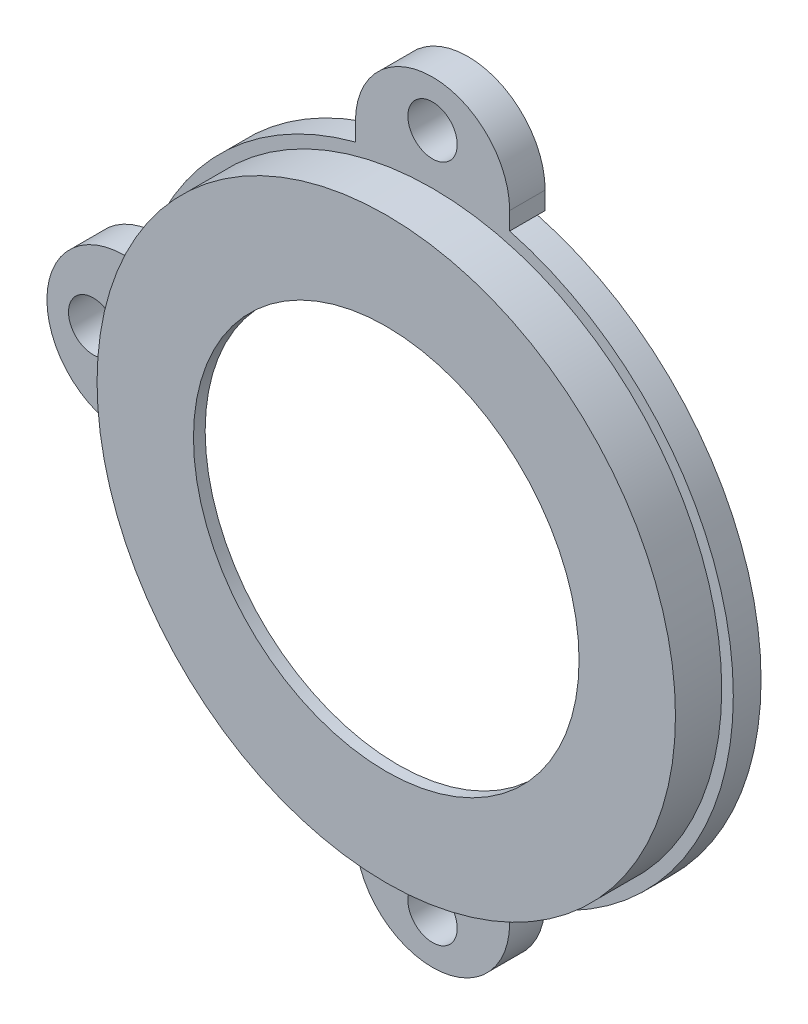
ISO-10303-21;
HEADER;
FILE_DESCRIPTION(('STEP AP214'),'2;1');
FILE_NAME('part.step','',(''),(''),'','','');
FILE_SCHEMA(('AUTOMOTIVE_DESIGN { 1 0 10303 214 1 1 1 1 }'));
ENDSEC;
DATA;
#1=APPLICATION_CONTEXT('core data for automotive mechanical design processes');
#2=APPLICATION_PROTOCOL_DEFINITION('international standard','automotive_design',2000,#1);
#3=PRODUCT_CONTEXT('',#1,'mechanical');
#4=PRODUCT('Part','Part','',(#3));
#5=PRODUCT_RELATED_PRODUCT_CATEGORY('part','',(#4));
#6=PRODUCT_DEFINITION_FORMATION('','',#4);
#7=PRODUCT_DEFINITION_CONTEXT('part definition',#1,'design');
#8=PRODUCT_DEFINITION('design','',#6,#7);
#9=PRODUCT_DEFINITION_SHAPE('','',#8);
#10=(LENGTH_UNIT() NAMED_UNIT(*) SI_UNIT(.MILLI.,.METRE.));
#11=(NAMED_UNIT(*) PLANE_ANGLE_UNIT() SI_UNIT($,.RADIAN.));
#12=(NAMED_UNIT(*) SI_UNIT($,.STERADIAN.) SOLID_ANGLE_UNIT());
#13=UNCERTAINTY_MEASURE_WITH_UNIT(LENGTH_MEASURE(1.E-05),#10,'distance_accuracy_value','');
#14=(GEOMETRIC_REPRESENTATION_CONTEXT(3) GLOBAL_UNCERTAINTY_ASSIGNED_CONTEXT((#13)) GLOBAL_UNIT_ASSIGNED_CONTEXT((#10,
#11,#12)) REPRESENTATION_CONTEXT('',''));
#15=CARTESIAN_POINT('',(0.,0.,0.));
#16=DIRECTION('',(0.,0.,1.));
#17=DIRECTION('',(1.,0.,0.));
#18=AXIS2_PLACEMENT_3D('',#15,#16,#17);
#19=CARTESIAN_POINT('',(0.,0.,1.8));
#20=DIRECTION('',(0.,0.,1.));
#21=DIRECTION('',(1.,0.,0.));
#22=AXIS2_PLACEMENT_3D('',#19,#20,#21);
#23=PLANE('',#22);
#24=CARTESIAN_POINT('',(-3.58827050328753E-12,-22.,1.8));
#25=DIRECTION('',(0.,0.,1.));
#26=DIRECTION('',(1.,0.,0.));
#27=AXIS2_PLACEMENT_3D('',#24,#25,#26);
#28=CIRCLE('',#27,1.6);
#29=CARTESIAN_POINT('',(1.59999999999641,-22.,1.8));
#30=VERTEX_POINT('',#29);
#31=EDGE_CURVE('E302',#30,#30,#28,.T.);
#32=ORIENTED_EDGE('',*,*,#31,.F.);
#33=EDGE_LOOP('',(#32));
#34=FACE_BOUND('',#33,.T.);
#35=CARTESIAN_POINT('',(0.,22.,1.8));
#36=DIRECTION('',(0.,0.,1.));
#37=DIRECTION('',(1.,0.,0.));
#38=AXIS2_PLACEMENT_3D('',#35,#36,#37);
#39=CIRCLE('',#38,1.6);
#40=CARTESIAN_POINT('',(1.6,22.,1.8));
#41=VERTEX_POINT('',#40);
#42=EDGE_CURVE('E199',#41,#41,#39,.T.);
#43=ORIENTED_EDGE('',*,*,#42,.F.);
#44=EDGE_LOOP('',(#43));
#45=FACE_BOUND('',#44,.T.);
#46=CARTESIAN_POINT('',(0.,-20.,1.8));
#47=DIRECTION('',(0.,0.,1.));
#48=DIRECTION('',(1.,0.,0.));
#49=AXIS2_PLACEMENT_3D('',#46,#47,#48);
#50=CIRCLE('',#49,5.);
#51=CARTESIAN_POINT('',(-5.,-20.,1.8));
#52=VERTEX_POINT('',#51);
#53=CARTESIAN_POINT('',(0.,-25.,1.8));
#54=VERTEX_POINT('',#53);
#55=EDGE_CURVE('E61',#52,#54,#50,.T.);
#56=ORIENTED_EDGE('',*,*,#55,.T.);
#57=CARTESIAN_POINT('',(0.,-20.,1.8));
#58=DIRECTION('',(0.,0.,1.));
#59=DIRECTION('',(1.,0.,0.));
#60=AXIS2_PLACEMENT_3D('',#57,#58,#59);
#61=CIRCLE('',#60,5.);
#62=CARTESIAN_POINT('',(5.,-20.,1.8));
#63=VERTEX_POINT('',#62);
#64=EDGE_CURVE('E380',#54,#63,#61,.T.);
#65=ORIENTED_EDGE('',*,*,#64,.T.);
#66=DIRECTION('',(0.,1.,0.));
#67=VECTOR('',#66,1.);
#68=CARTESIAN_POINT('',(5.,-25.,1.8));
#69=LINE('',#68,#67);
#70=CARTESIAN_POINT('',(5.,-18.8480768249708,1.8));
#71=VERTEX_POINT('',#70);
#72=EDGE_CURVE('E185',#63,#71,#69,.T.);
#73=ORIENTED_EDGE('',*,*,#72,.T.);
#74=CARTESIAN_POINT('',(0.,0.,1.8));
#75=DIRECTION('',(0.,0.,1.));
#76=DIRECTION('',(1.,0.,0.));
#77=AXIS2_PLACEMENT_3D('',#74,#75,#76);
#78=CIRCLE('',#77,19.5);
#79=CARTESIAN_POINT('',(5.,18.8480768249708,1.8));
#80=VERTEX_POINT('',#79);
#81=EDGE_CURVE('E179',#71,#80,#78,.T.);
#82=ORIENTED_EDGE('',*,*,#81,.T.);
#83=DIRECTION('',(0.,1.,0.));
#84=VECTOR('',#83,1.);
#85=CARTESIAN_POINT('',(5.,18.8480768249708,1.8));
#86=LINE('',#85,#84);
#87=CARTESIAN_POINT('',(5.,20.,1.8));
#88=VERTEX_POINT('',#87);
#89=EDGE_CURVE('E316',#80,#88,#86,.T.);
#90=ORIENTED_EDGE('',*,*,#89,.T.);
#91=CARTESIAN_POINT('',(0.,20.,1.8));
#92=DIRECTION('',(0.,0.,1.));
#93=DIRECTION('',(1.,0.,0.));
#94=AXIS2_PLACEMENT_3D('',#91,#92,#93);
#95=CIRCLE('',#94,5.);
#96=CARTESIAN_POINT('',(0.,25.,1.8));
#97=VERTEX_POINT('',#96);
#98=EDGE_CURVE('E375',#88,#97,#95,.T.);
#99=ORIENTED_EDGE('',*,*,#98,.T.);
#100=CARTESIAN_POINT('',(0.,20.,1.8));
#101=DIRECTION('',(0.,0.,1.));
#102=DIRECTION('',(1.,0.,0.));
#103=AXIS2_PLACEMENT_3D('',#100,#101,#102);
#104=CIRCLE('',#103,5.);
#105=CARTESIAN_POINT('',(-5.,20.,1.8));
#106=VERTEX_POINT('',#105);
#107=EDGE_CURVE('E372',#97,#106,#104,.T.);
#108=ORIENTED_EDGE('',*,*,#107,.T.);
#109=DIRECTION('',(0.,-1.,0.));
#110=VECTOR('',#109,1.);
#111=CARTESIAN_POINT('',(-5.,25.,1.8));
#112=LINE('',#111,#110);
#113=CARTESIAN_POINT('',(-5.00000000000001,18.8480768249708,1.8));
#114=VERTEX_POINT('',#113);
#115=EDGE_CURVE('E321',#106,#114,#112,.T.);
#116=ORIENTED_EDGE('',*,*,#115,.T.);
#117=CARTESIAN_POINT('',(0.,0.,1.8));
#118=DIRECTION('',(0.,0.,1.));
#119=DIRECTION('',(1.,0.,0.));
#120=AXIS2_PLACEMENT_3D('',#117,#118,#119);
#121=CIRCLE('',#120,19.5);
#122=CARTESIAN_POINT('',(-18.8480768249704,5.00000000000154,1.8));
#123=VERTEX_POINT('',#122);
#124=EDGE_CURVE('E324',#114,#123,#121,.T.);
#125=ORIENTED_EDGE('',*,*,#124,.T.);
#126=DIRECTION('',(-1.,0.,0.));
#127=VECTOR('',#126,1.);
#128=CARTESIAN_POINT('',(-18.8480768249704,5.00000000000154,1.8));
#129=LINE('',#128,#127);
#130=CARTESIAN_POINT('',(-20.,5.00000000000154,1.8));
#131=VERTEX_POINT('',#130);
#132=EDGE_CURVE('E327',#123,#131,#129,.T.);
#133=ORIENTED_EDGE('',*,*,#132,.T.);
#134=CARTESIAN_POINT('',(-20.,1.53783236145344E-12,1.8));
#135=DIRECTION('',(0.,0.,1.));
#136=DIRECTION('',(1.,0.,0.));
#137=AXIS2_PLACEMENT_3D('',#134,#135,#136);
#138=CIRCLE('',#137,5.);
#139=CARTESIAN_POINT('',(-25.,1.53783236145344E-12,1.8));
#140=VERTEX_POINT('',#139);
#141=EDGE_CURVE('E366',#131,#140,#138,.T.);
#142=ORIENTED_EDGE('',*,*,#141,.T.);
#143=CARTESIAN_POINT('',(-20.,1.53696499971545E-12,1.8));
#144=DIRECTION('',(0.,0.,1.));
#145=DIRECTION('',(1.,0.,0.));
#146=AXIS2_PLACEMENT_3D('',#143,#144,#145);
#147=CIRCLE('',#146,5.);
#148=CARTESIAN_POINT('',(-20.,-4.99999999999846,1.8));
#149=VERTEX_POINT('',#148);
#150=EDGE_CURVE('E369',#140,#149,#147,.T.);
#151=ORIENTED_EDGE('',*,*,#150,.T.);
#152=DIRECTION('',(1.,0.,0.));
#153=VECTOR('',#152,1.);
#154=CARTESIAN_POINT('',(-25.,-4.99999999999846,1.8));
#155=LINE('',#154,#153);
#156=CARTESIAN_POINT('',(-18.8480768249704,-4.99999999999846,1.8));
#157=VERTEX_POINT('',#156);
#158=EDGE_CURVE('E331',#149,#157,#155,.T.);
#159=ORIENTED_EDGE('',*,*,#158,.T.);
#160=CARTESIAN_POINT('',(0.,0.,1.8));
#161=DIRECTION('',(0.,0.,1.));
#162=DIRECTION('',(1.,0.,0.));
#163=AXIS2_PLACEMENT_3D('',#160,#161,#162);
#164=CIRCLE('',#163,19.4999999999992);
#165=CARTESIAN_POINT('',(-5.,-18.8480768249699,1.8));
#166=VERTEX_POINT('',#165);
#167=EDGE_CURVE('E334',#157,#166,#164,.T.);
#168=ORIENTED_EDGE('',*,*,#167,.T.);
#169=DIRECTION('',(0.,-1.,0.));
#170=VECTOR('',#169,1.);
#171=CARTESIAN_POINT('',(-5.,-18.8480768249699,1.8));
#172=LINE('',#171,#170);
#173=EDGE_CURVE('E337',#166,#52,#172,.T.);
#174=ORIENTED_EDGE('',*,*,#173,.T.);
#175=EDGE_LOOP('',(#56,#65,#73,#82,#90,#99,#108,#116,#125,#133,#142,#151,#159,#168,#174));
#176=FACE_BOUND('',#175,.T.);
#177=CARTESIAN_POINT('',(-22.,1.79413525164376E-12,1.8));
#178=DIRECTION('',(0.,0.,1.));
#179=DIRECTION('',(1.,0.,0.));
#180=AXIS2_PLACEMENT_3D('',#177,#178,#179);
#181=CIRCLE('',#180,1.6);
#182=CARTESIAN_POINT('',(-20.4,1.79413525164376E-12,1.8));
#183=VERTEX_POINT('',#182);
#184=EDGE_CURVE('E306',#183,#183,#181,.T.);
#185=ORIENTED_EDGE('',*,*,#184,.F.);
#186=EDGE_LOOP('',(#185));
#187=FACE_BOUND('',#186,.T.);
#188=CARTESIAN_POINT('',(0.,0.,1.8));
#189=DIRECTION('',(0.,0.,1.));
#190=DIRECTION('',(1.,0.,0.));
#191=AXIS2_PLACEMENT_3D('',#188,#189,#190);
#192=CIRCLE('',#191,18.75);
#193=CARTESIAN_POINT('',(18.75,0.,1.8));
#194=VERTEX_POINT('',#193);
#195=EDGE_CURVE('E293',#194,#194,#192,.T.);
#196=ORIENTED_EDGE('',*,*,#195,.F.);
#197=EDGE_LOOP('',(#196));
#198=FACE_BOUND('',#197,.T.);
#199=ADVANCED_FACE('F43',(#34,#45,#176,#187,#198),#23,.T.);
#200=CARTESIAN_POINT('',(0.,0.,1.8));
#201=DIRECTION('',(0.,0.,-1.));
#202=DIRECTION('',(-1.,0.,0.));
#203=AXIS2_PLACEMENT_3D('',#200,#201,#202);
#204=CYLINDRICAL_SURFACE('',#203,19.5);
#205=CARTESIAN_POINT('',(0.,0.,0.));
#206=DIRECTION('',(0.,0.,1.));
#207=DIRECTION('',(1.,0.,0.));
#208=AXIS2_PLACEMENT_3D('',#205,#206,#207);
#209=CIRCLE('',#208,19.5);
#210=CARTESIAN_POINT('',(4.99999999999986,-18.8480768249702,0.));
#211=VERTEX_POINT('',#210);
#212=CARTESIAN_POINT('',(5.,18.8480768249708,0.));
#213=VERTEX_POINT('',#212);
#214=EDGE_CURVE('E176',#211,#213,#209,.T.);
#215=ORIENTED_EDGE('',*,*,#214,.T.);
#216=DIRECTION('',(0.,0.,-1.));
#217=VECTOR('',#216,1.);
#218=CARTESIAN_POINT('',(5.,18.8480768249708,1.8));
#219=LINE('',#218,#217);
#220=EDGE_CURVE('E360',#80,#213,#219,.T.);
#221=ORIENTED_EDGE('',*,*,#220,.F.);
#222=ORIENTED_EDGE('',*,*,#81,.F.);
#223=DIRECTION('',(0.,0.,-1.));
#224=VECTOR('',#223,1.);
#225=CARTESIAN_POINT('',(5.,-18.8480768249708,1.8));
#226=LINE('',#225,#224);
#227=EDGE_CURVE('E172',#71,#211,#226,.T.);
#228=ORIENTED_EDGE('',*,*,#227,.T.);
#229=EDGE_LOOP('',(#215,#221,#222,#228));
#230=FACE_BOUND('',#229,.T.);
#231=ADVANCED_FACE('F174',(#230),#204,.T.);
#232=CARTESIAN_POINT('',(5.,18.8480768249708,1.8));
#233=DIRECTION('',(-1.,0.,0.));
#234=DIRECTION('',(0.,-1.,0.));
#235=AXIS2_PLACEMENT_3D('',#232,#233,#234);
#236=PLANE('',#235);
#237=ORIENTED_EDGE('',*,*,#220,.T.);
#238=DIRECTION('',(0.,0.,1.));
#239=VECTOR('',#238,1.);
#240=CARTESIAN_POINT('',(5.,18.8480768249708,-0.5));
#241=LINE('',#240,#239);
#242=CARTESIAN_POINT('',(5.,18.8480768249708,-0.5));
#243=VERTEX_POINT('',#242);
#244=EDGE_CURVE('E212',#243,#213,#241,.T.);
#245=ORIENTED_EDGE('',*,*,#244,.F.);
#246=DIRECTION('',(0.,-1.,0.));
#247=VECTOR('',#246,1.);
#248=CARTESIAN_POINT('',(5.,20.,-0.5));
#249=LINE('',#248,#247);
#250=CARTESIAN_POINT('',(5.,20.,-0.5));
#251=VERTEX_POINT('',#250);
#252=EDGE_CURVE('E272',#251,#243,#249,.T.);
#253=ORIENTED_EDGE('',*,*,#252,.F.);
#254=DIRECTION('',(0.,0.,-1.));
#255=VECTOR('',#254,1.);
#256=CARTESIAN_POINT('',(5.,20.,1.8));
#257=LINE('',#256,#255);
#258=EDGE_CURVE('E385',#251,#88,#257,.F.);
#259=ORIENTED_EDGE('',*,*,#258,.T.);
#260=ORIENTED_EDGE('',*,*,#89,.F.);
#261=EDGE_LOOP('',(#237,#245,#253,#259,#260));
#262=FACE_BOUND('',#261,.T.);
#263=ADVANCED_FACE('F441',(#262),#236,.F.);
#264=CARTESIAN_POINT('',(-5.,25.,1.8));
#265=DIRECTION('',(1.,0.,0.));
#266=DIRECTION('',(0.,1.,0.));
#267=AXIS2_PLACEMENT_3D('',#264,#265,#266);
#268=PLANE('',#267);
#269=ORIENTED_EDGE('',*,*,#115,.F.);
#270=DIRECTION('',(0.,0.,-1.));
#271=VECTOR('',#270,1.);
#272=CARTESIAN_POINT('',(-5.,20.,1.8));
#273=LINE('',#272,#271);
#274=CARTESIAN_POINT('',(-5.,20.,-0.5));
#275=VERTEX_POINT('',#274);
#276=EDGE_CURVE('E389',#106,#275,#273,.T.);
#277=ORIENTED_EDGE('',*,*,#276,.T.);
#278=DIRECTION('',(0.,1.,0.));
#279=VECTOR('',#278,1.);
#280=CARTESIAN_POINT('',(-5.00000000000001,18.8480768249708,-0.5));
#281=LINE('',#280,#279);
#282=CARTESIAN_POINT('',(-5.00000000000001,18.8480768249708,-0.5));
#283=VERTEX_POINT('',#282);
#284=EDGE_CURVE('E278',#283,#275,#281,.T.);
#285=ORIENTED_EDGE('',*,*,#284,.F.);
#286=DIRECTION('',(0.,0.,1.));
#287=VECTOR('',#286,1.);
#288=CARTESIAN_POINT('',(-5.00000000000001,18.8480768249708,-0.5));
#289=LINE('',#288,#287);
#290=CARTESIAN_POINT('',(-5.00000000000001,18.8480768249708,0.));
#291=VERTEX_POINT('',#290);
#292=EDGE_CURVE('E282',#283,#291,#289,.T.);
#293=ORIENTED_EDGE('',*,*,#292,.T.);
#294=DIRECTION('',(0.,0.,-1.));
#295=VECTOR('',#294,1.);
#296=CARTESIAN_POINT('',(-5.00000000000001,18.8480768249708,1.8));
#297=LINE('',#296,#295);
#298=EDGE_CURVE('E357',#114,#291,#297,.T.);
#299=ORIENTED_EDGE('',*,*,#298,.F.);
#300=EDGE_LOOP('',(#269,#277,#285,#293,#299));
#301=FACE_BOUND('',#300,.T.);
#302=ADVANCED_FACE('F608',(#301),#268,.F.);
#303=CARTESIAN_POINT('',(0.,0.,1.8));
#304=DIRECTION('',(0.,0.,-1.));
#305=DIRECTION('',(-1.,0.,0.));
#306=AXIS2_PLACEMENT_3D('',#303,#304,#305);
#307=CYLINDRICAL_SURFACE('',#306,19.5);
#308=CARTESIAN_POINT('',(0.,0.,0.));
#309=DIRECTION('',(0.,0.,1.));
#310=DIRECTION('',(1.,0.,0.));
#311=AXIS2_PLACEMENT_3D('',#308,#309,#310);
#312=CIRCLE('',#311,19.5);
#313=CARTESIAN_POINT('',(-18.8480768249704,5.00000000000154,0.));
#314=VERTEX_POINT('',#313);
#315=EDGE_CURVE('E198',#291,#314,#312,.T.);
#316=ORIENTED_EDGE('',*,*,#315,.T.);
#317=DIRECTION('',(0.,0.,-1.));
#318=VECTOR('',#317,1.);
#319=CARTESIAN_POINT('',(-18.8480768249704,5.00000000000154,1.8));
#320=LINE('',#319,#318);
#321=EDGE_CURVE('E353',#123,#314,#320,.T.);
#322=ORIENTED_EDGE('',*,*,#321,.F.);
#323=ORIENTED_EDGE('',*,*,#124,.F.);
#324=ORIENTED_EDGE('',*,*,#298,.T.);
#325=EDGE_LOOP('',(#316,#322,#323,#324));
#326=FACE_BOUND('',#325,.T.);
#327=ADVANCED_FACE('F596',(#326),#307,.T.);
#328=CARTESIAN_POINT('',(-18.8480768249704,5.00000000000154,1.8));
#329=DIRECTION('',(0.,-1.,0.));
#330=DIRECTION('',(1.,0.,0.));
#331=AXIS2_PLACEMENT_3D('',#328,#329,#330);
#332=PLANE('',#331);
#333=ORIENTED_EDGE('',*,*,#321,.T.);
#334=DIRECTION('',(0.,0.,1.));
#335=VECTOR('',#334,1.);
#336=CARTESIAN_POINT('',(-18.8480768249704,5.00000000000154,-0.5));
#337=LINE('',#336,#335);
#338=CARTESIAN_POINT('',(-18.8480768249704,5.00000000000154,-0.5));
#339=VERTEX_POINT('',#338);
#340=EDGE_CURVE('E238',#339,#314,#337,.T.);
#341=ORIENTED_EDGE('',*,*,#340,.F.);
#342=DIRECTION('',(1.,0.,0.));
#343=VECTOR('',#342,1.);
#344=CARTESIAN_POINT('',(-20.,5.00000000000154,-0.5));
#345=LINE('',#344,#343);
#346=CARTESIAN_POINT('',(-20.,5.00000000000154,-0.5));
#347=VERTEX_POINT('',#346);
#348=EDGE_CURVE('E253',#347,#339,#345,.T.);
#349=ORIENTED_EDGE('',*,*,#348,.F.);
#350=DIRECTION('',(0.,0.,-1.));
#351=VECTOR('',#350,1.);
#352=CARTESIAN_POINT('',(-20.,5.00000000000154,1.8));
#353=LINE('',#352,#351);
#354=EDGE_CURVE('E11',#347,#131,#353,.F.);
#355=ORIENTED_EDGE('',*,*,#354,.T.);
#356=ORIENTED_EDGE('',*,*,#132,.F.);
#357=EDGE_LOOP('',(#333,#341,#349,#355,#356));
#358=FACE_BOUND('',#357,.T.);
#359=ADVANCED_FACE('F587',(#358),#332,.F.);
#360=CARTESIAN_POINT('',(-25.,-4.99999999999846,1.8));
#361=DIRECTION('',(0.,1.,0.));
#362=DIRECTION('',(0.,0.,1.));
#363=AXIS2_PLACEMENT_3D('',#360,#361,#362);
#364=PLANE('',#363);
#365=ORIENTED_EDGE('',*,*,#158,.F.);
#366=DIRECTION('',(0.,0.,-1.));
#367=VECTOR('',#366,1.);
#368=CARTESIAN_POINT('',(-20.,-4.99999999999846,1.8));
#369=LINE('',#368,#367);
#370=CARTESIAN_POINT('',(-20.,-4.99999999999846,-0.5));
#371=VERTEX_POINT('',#370);
#372=EDGE_CURVE('E53',#149,#371,#369,.T.);
#373=ORIENTED_EDGE('',*,*,#372,.T.);
#374=DIRECTION('',(-1.,1.79206476713228E-13,0.));
#375=VECTOR('',#374,1.);
#376=CARTESIAN_POINT('',(-18.8480768249711,-4.99999999999867,-0.5));
#377=LINE('',#376,#375);
#378=CARTESIAN_POINT('',(-18.8480768249711,-4.99999999999867,-0.5));
#379=VERTEX_POINT('',#378);
#380=EDGE_CURVE('E246',#379,#371,#377,.T.);
#381=ORIENTED_EDGE('',*,*,#380,.F.);
#382=DIRECTION('',(0.,0.,1.));
#383=VECTOR('',#382,1.);
#384=CARTESIAN_POINT('',(-18.8480768249711,-4.99999999999867,-0.5));
#385=LINE('',#384,#383);
#386=CARTESIAN_POINT('',(-18.8480768249711,-4.99999999999867,0.));
#387=VERTEX_POINT('',#386);
#388=EDGE_CURVE('E242',#379,#387,#385,.T.);
#389=ORIENTED_EDGE('',*,*,#388,.T.);
#390=DIRECTION('',(0.,0.,-1.));
#391=VECTOR('',#390,1.);
#392=CARTESIAN_POINT('',(-18.8480768249704,-4.99999999999846,1.8));
#393=LINE('',#392,#391);
#394=EDGE_CURVE('E350',#157,#387,#393,.T.);
#395=ORIENTED_EDGE('',*,*,#394,.F.);
#396=EDGE_LOOP('',(#365,#373,#381,#389,#395));
#397=FACE_BOUND('',#396,.T.);
#398=ADVANCED_FACE('F410',(#397),#364,.F.);
#399=CARTESIAN_POINT('',(0.,0.,1.8));
#400=DIRECTION('',(0.,0.,-1.));
#401=DIRECTION('',(-1.,0.,0.));
#402=AXIS2_PLACEMENT_3D('',#399,#400,#401);
#403=CYLINDRICAL_SURFACE('',#402,19.4999999999992);
#404=CARTESIAN_POINT('',(0.,0.,0.));
#405=DIRECTION('',(0.,0.,1.));
#406=DIRECTION('',(1.,0.,0.));
#407=AXIS2_PLACEMENT_3D('',#404,#405,#406);
#408=CIRCLE('',#407,19.4999999999992);
#409=CARTESIAN_POINT('',(-5.,-18.8480768249699,0.));
#410=VERTEX_POINT('',#409);
#411=EDGE_CURVE('E317',#387,#410,#408,.T.);
#412=ORIENTED_EDGE('',*,*,#411,.T.);
#413=DIRECTION('',(0.,0.,-1.));
#414=VECTOR('',#413,1.);
#415=CARTESIAN_POINT('',(-5.,-18.8480768249699,1.8));
#416=LINE('',#415,#414);
#417=EDGE_CURVE('E184',#166,#410,#416,.T.);
#418=ORIENTED_EDGE('',*,*,#417,.F.);
#419=ORIENTED_EDGE('',*,*,#167,.F.);
#420=ORIENTED_EDGE('',*,*,#394,.T.);
#421=EDGE_LOOP('',(#412,#418,#419,#420));
#422=FACE_BOUND('',#421,.T.);
#423=ADVANCED_FACE('F416',(#422),#403,.T.);
#424=CARTESIAN_POINT('',(-5.,-18.8480768249699,1.8));
#425=DIRECTION('',(1.,0.,0.));
#426=DIRECTION('',(0.,1.,0.));
#427=AXIS2_PLACEMENT_3D('',#424,#425,#426);
#428=PLANE('',#427);
#429=ORIENTED_EDGE('',*,*,#417,.T.);
#430=DIRECTION('',(0.,0.,1.));
#431=VECTOR('',#430,1.);
#432=CARTESIAN_POINT('',(-5.,-18.8480768249699,-0.5));
#433=LINE('',#432,#431);
#434=CARTESIAN_POINT('',(-5.,-18.8480768249699,-0.5));
#435=VERTEX_POINT('',#434);
#436=EDGE_CURVE('E209',#435,#410,#433,.T.);
#437=ORIENTED_EDGE('',*,*,#436,.F.);
#438=DIRECTION('',(0.,1.,0.));
#439=VECTOR('',#438,1.);
#440=CARTESIAN_POINT('',(-5.,-20.,-0.5));
#441=LINE('',#440,#439);
#442=CARTESIAN_POINT('',(-5.,-20.,-0.5));
#443=VERTEX_POINT('',#442);
#444=EDGE_CURVE('E227',#443,#435,#441,.T.);
#445=ORIENTED_EDGE('',*,*,#444,.F.);
#446=DIRECTION('',(0.,0.,-1.));
#447=VECTOR('',#446,1.);
#448=CARTESIAN_POINT('',(-5.,-20.,1.8));
#449=LINE('',#448,#447);
#450=EDGE_CURVE('E69',#443,#52,#449,.F.);
#451=ORIENTED_EDGE('',*,*,#450,.T.);
#452=ORIENTED_EDGE('',*,*,#173,.F.);
#453=EDGE_LOOP('',(#429,#437,#445,#451,#452));
#454=FACE_BOUND('',#453,.T.);
#455=ADVANCED_FACE('F425',(#454),#428,.F.);
#456=CARTESIAN_POINT('',(5.,-25.,1.8));
#457=DIRECTION('',(-1.,0.,0.));
#458=DIRECTION('',(0.,-1.,0.));
#459=AXIS2_PLACEMENT_3D('',#456,#457,#458);
#460=PLANE('',#459);
#461=ORIENTED_EDGE('',*,*,#72,.F.);
#462=DIRECTION('',(0.,0.,-1.));
#463=VECTOR('',#462,1.);
#464=CARTESIAN_POINT('',(5.,-20.,1.8));
#465=LINE('',#464,#463);
#466=CARTESIAN_POINT('',(5.,-20.,-0.5));
#467=VERTEX_POINT('',#466);
#468=EDGE_CURVE('E363',#63,#467,#465,.T.);
#469=ORIENTED_EDGE('',*,*,#468,.T.);
#470=DIRECTION('',(0.,-1.,0.));
#471=VECTOR('',#470,1.);
#472=CARTESIAN_POINT('',(4.99999999999991,-18.8480768249704,-0.5));
#473=LINE('',#472,#471);
#474=CARTESIAN_POINT('',(4.99999999999986,-18.8480768249702,-0.5));
#475=VERTEX_POINT('',#474);
#476=EDGE_CURVE('E216',#475,#467,#473,.T.);
#477=ORIENTED_EDGE('',*,*,#476,.F.);
#478=DIRECTION('',(0.,0.,1.));
#479=VECTOR('',#478,1.);
#480=CARTESIAN_POINT('',(4.99999999999986,-18.8480768249702,-0.5));
#481=LINE('',#480,#479);
#482=EDGE_CURVE('E206',#475,#211,#481,.T.);
#483=ORIENTED_EDGE('',*,*,#482,.T.);
#484=ORIENTED_EDGE('',*,*,#227,.F.);
#485=EDGE_LOOP('',(#461,#469,#477,#483,#484));
#486=FACE_BOUND('',#485,.T.);
#487=ADVANCED_FACE('F214',(#486),#460,.F.);
#488=CARTESIAN_POINT('',(0.,0.,1.8));
#489=DIRECTION('',(0.,0.,-1.));
#490=DIRECTION('',(-1.,0.,0.));
#491=AXIS2_PLACEMENT_3D('',#488,#489,#490);
#492=CYLINDRICAL_SURFACE('',#491,12.5);
#493=CARTESIAN_POINT('',(0.,0.,4.04145188432739));
#494=DIRECTION('',(0.,0.,-1.));
#495=DIRECTION('',(-1.,0.,0.));
#496=AXIS2_PLACEMENT_3D('',#493,#494,#495);
#497=CIRCLE('',#496,12.5);
#498=CARTESIAN_POINT('',(-12.5,0.,4.04145188432739));
#499=VERTEX_POINT('',#498);
#500=EDGE_CURVE('E47',#499,#499,#497,.F.);
#501=ORIENTED_EDGE('',*,*,#500,.F.);
#502=EDGE_LOOP('',(#501));
#503=FACE_BOUND('',#502,.T.);
#504=CARTESIAN_POINT('',(0.,0.,4.8));
#505=DIRECTION('',(0.,0.,1.));
#506=DIRECTION('',(1.,0.,0.));
#507=AXIS2_PLACEMENT_3D('',#504,#505,#506);
#508=CIRCLE('',#507,12.5);
#509=CARTESIAN_POINT('',(12.5,0.,4.8));
#510=VERTEX_POINT('',#509);
#511=EDGE_CURVE('E289',#510,#510,#508,.T.);
#512=ORIENTED_EDGE('',*,*,#511,.T.);
#513=EDGE_LOOP('',(#512));
#514=FACE_BOUND('',#513,.T.);
#515=ADVANCED_FACE('F432',(#503,#514),#492,.F.);
#516=CARTESIAN_POINT('',(0.,22.,1.8));
#517=DIRECTION('',(0.,0.,-1.));
#518=DIRECTION('',(-1.,0.,0.));
#519=AXIS2_PLACEMENT_3D('',#516,#517,#518);
#520=CYLINDRICAL_SURFACE('',#519,1.6);
#521=ORIENTED_EDGE('',*,*,#42,.T.);
#522=EDGE_LOOP('',(#521));
#523=FACE_BOUND('',#522,.T.);
#524=CARTESIAN_POINT('',(0.,22.,-0.5));
#525=DIRECTION('',(0.,0.,-1.));
#526=DIRECTION('',(-1.,0.,0.));
#527=AXIS2_PLACEMENT_3D('',#524,#525,#526);
#528=CIRCLE('',#527,1.6);
#529=CARTESIAN_POINT('',(-1.6,22.,-0.5));
#530=VERTEX_POINT('',#529);
#531=EDGE_CURVE('E264',#530,#530,#528,.T.);
#532=ORIENTED_EDGE('',*,*,#531,.T.);
#533=EDGE_LOOP('',(#532));
#534=FACE_BOUND('',#533,.T.);
#535=ADVANCED_FACE('F448',(#523,#534),#520,.F.);
#536=CARTESIAN_POINT('',(-22.,1.79413525164376E-12,1.8));
#537=DIRECTION('',(0.,0.,-1.));
#538=DIRECTION('',(-1.,0.,0.));
#539=AXIS2_PLACEMENT_3D('',#536,#537,#538);
#540=CYLINDRICAL_SURFACE('',#539,1.6);
#541=ORIENTED_EDGE('',*,*,#184,.T.);
#542=EDGE_LOOP('',(#541));
#543=FACE_BOUND('',#542,.T.);
#544=CARTESIAN_POINT('',(-22.,1.79413525164376E-12,-0.5));
#545=DIRECTION('',(0.,0.,-1.));
#546=DIRECTION('',(-1.,0.,0.));
#547=AXIS2_PLACEMENT_3D('',#544,#545,#546);
#548=CIRCLE('',#547,1.6);
#549=CARTESIAN_POINT('',(-23.6,1.79413525164376E-12,-0.5));
#550=VERTEX_POINT('',#549);
#551=EDGE_CURVE('E260',#550,#550,#548,.T.);
#552=ORIENTED_EDGE('',*,*,#551,.T.);
#553=EDGE_LOOP('',(#552));
#554=FACE_BOUND('',#553,.T.);
#555=ADVANCED_FACE('F452',(#543,#554),#540,.F.);
#556=CARTESIAN_POINT('',(-3.58827050328753E-12,-22.,1.8));
#557=DIRECTION('',(0.,0.,-1.));
#558=DIRECTION('',(-1.,0.,0.));
#559=AXIS2_PLACEMENT_3D('',#556,#557,#558);
#560=CYLINDRICAL_SURFACE('',#559,1.6);
#561=ORIENTED_EDGE('',*,*,#31,.T.);
#562=EDGE_LOOP('',(#561));
#563=FACE_BOUND('',#562,.T.);
#564=CARTESIAN_POINT('',(-3.58827050328753E-12,-22.,-0.5));
#565=DIRECTION('',(0.,0.,-1.));
#566=DIRECTION('',(-1.,0.,0.));
#567=AXIS2_PLACEMENT_3D('',#564,#565,#566);
#568=CIRCLE('',#567,1.6);
#569=CARTESIAN_POINT('',(-1.60000000000359,-22.,-0.5));
#570=VERTEX_POINT('',#569);
#571=EDGE_CURVE('E234',#570,#570,#568,.T.);
#572=ORIENTED_EDGE('',*,*,#571,.T.);
#573=EDGE_LOOP('',(#572));
#574=FACE_BOUND('',#573,.T.);
#575=ADVANCED_FACE('F456',(#563,#574),#560,.F.);
#576=CARTESIAN_POINT('',(0.,-20.,1.8));
#577=DIRECTION('',(0.,0.,-1.));
#578=DIRECTION('',(-1.,0.,0.));
#579=AXIS2_PLACEMENT_3D('',#576,#577,#578);
#580=CYLINDRICAL_SURFACE('',#579,5.);
#581=DIRECTION('',(0.,0.,-1.));
#582=VECTOR('',#581,1.);
#583=CARTESIAN_POINT('',(0.,-25.,1.8));
#584=LINE('',#583,#582);
#585=CARTESIAN_POINT('',(0.,-25.,0.));
#586=VERTEX_POINT('',#585);
#587=EDGE_CURVE('E307',#54,#586,#584,.T.);
#588=ORIENTED_EDGE('',*,*,#587,.F.);
#589=ORIENTED_EDGE('',*,*,#55,.F.);
#590=ORIENTED_EDGE('',*,*,#450,.F.);
#591=CARTESIAN_POINT('',(0.,-20.,-0.5));
#592=DIRECTION('',(0.,0.,-1.));
#593=DIRECTION('',(-1.,0.,0.));
#594=AXIS2_PLACEMENT_3D('',#591,#592,#593);
#595=CIRCLE('',#594,5.);
#596=EDGE_CURVE('E230',#467,#443,#595,.T.);
#597=ORIENTED_EDGE('',*,*,#596,.F.);
#598=ORIENTED_EDGE('',*,*,#468,.F.);
#599=ORIENTED_EDGE('',*,*,#64,.F.);
#600=ORIENTED_EDGE('',*,*,#587,.T.);
#601=EDGE_LOOP('',(#588,#589,#590,#597,#598,#599,#600));
#602=FACE_BOUND('',#601,.T.);
#603=ADVANCED_FACE('F418',(#602),#580,.T.);
#604=CARTESIAN_POINT('',(0.,20.,1.8));
#605=DIRECTION('',(0.,0.,-1.));
#606=DIRECTION('',(-1.,0.,0.));
#607=AXIS2_PLACEMENT_3D('',#604,#605,#606);
#608=CYLINDRICAL_SURFACE('',#607,5.);
#609=ORIENTED_EDGE('',*,*,#276,.F.);
#610=ORIENTED_EDGE('',*,*,#107,.F.);
#611=DIRECTION('',(0.,0.,-1.));
#612=VECTOR('',#611,1.);
#613=CARTESIAN_POINT('',(0.,25.,1.8));
#614=LINE('',#613,#612);
#615=CARTESIAN_POINT('',(0.,25.,0.));
#616=VERTEX_POINT('',#615);
#617=EDGE_CURVE('E396',#616,#97,#614,.F.);
#618=ORIENTED_EDGE('',*,*,#617,.F.);
#619=ORIENTED_EDGE('',*,*,#617,.T.);
#620=ORIENTED_EDGE('',*,*,#98,.F.);
#621=ORIENTED_EDGE('',*,*,#258,.F.);
#622=CARTESIAN_POINT('',(0.,20.,-0.5));
#623=DIRECTION('',(0.,0.,-1.));
#624=DIRECTION('',(-1.,0.,0.));
#625=AXIS2_PLACEMENT_3D('',#622,#623,#624);
#626=CIRCLE('',#625,5.);
#627=EDGE_CURVE('E268',#275,#251,#626,.T.);
#628=ORIENTED_EDGE('',*,*,#627,.F.);
#629=EDGE_LOOP('',(#609,#610,#618,#619,#620,#621,#628));
#630=FACE_BOUND('',#629,.T.);
#631=ADVANCED_FACE('F532',(#630),#608,.T.);
#632=CARTESIAN_POINT('',(-20.,1.53783236145344E-12,1.8));
#633=DIRECTION('',(0.,0.,-1.));
#634=DIRECTION('',(-1.,0.,0.));
#635=AXIS2_PLACEMENT_3D('',#632,#633,#634);
#636=CYLINDRICAL_SURFACE('',#635,5.);
#637=DIRECTION('',(0.,0.,-1.));
#638=VECTOR('',#637,1.);
#639=CARTESIAN_POINT('',(-25.,1.53783236145344E-12,1.8));
#640=LINE('',#639,#638);
#641=CARTESIAN_POINT('',(-25.,1.53783236145344E-12,0.));
#642=VERTEX_POINT('',#641);
#643=EDGE_CURVE('E298',#140,#642,#640,.T.);
#644=ORIENTED_EDGE('',*,*,#643,.F.);
#645=ORIENTED_EDGE('',*,*,#141,.F.);
#646=ORIENTED_EDGE('',*,*,#354,.F.);
#647=CARTESIAN_POINT('',(-20.,1.53783236145344E-12,-0.5));
#648=DIRECTION('',(0.,0.,-1.));
#649=DIRECTION('',(-1.,0.,0.));
#650=AXIS2_PLACEMENT_3D('',#647,#648,#649);
#651=CIRCLE('',#650,5.);
#652=EDGE_CURVE('E256',#371,#347,#651,.T.);
#653=ORIENTED_EDGE('',*,*,#652,.F.);
#654=ORIENTED_EDGE('',*,*,#372,.F.);
#655=ORIENTED_EDGE('',*,*,#150,.F.);
#656=ORIENTED_EDGE('',*,*,#643,.T.);
#657=EDGE_LOOP('',(#644,#645,#646,#653,#654,#655,#656));
#658=FACE_BOUND('',#657,.T.);
#659=ADVANCED_FACE('F45',(#658),#636,.T.);
#660=CARTESIAN_POINT('',(0.,0.,4.8));
#661=DIRECTION('',(0.,0.,1.));
#662=DIRECTION('',(1.,0.,0.));
#663=AXIS2_PLACEMENT_3D('',#660,#661,#662);
#664=PLANE('',#663);
#665=CARTESIAN_POINT('',(0.,0.,4.8));
#666=DIRECTION('',(0.,0.,1.));
#667=DIRECTION('',(1.,0.,0.));
#668=AXIS2_PLACEMENT_3D('',#665,#666,#667);
#669=CIRCLE('',#668,18.75);
#670=CARTESIAN_POINT('',(18.75,0.,4.8));
#671=VERTEX_POINT('',#670);
#672=EDGE_CURVE('E294',#671,#671,#669,.T.);
#673=ORIENTED_EDGE('',*,*,#672,.T.);
#674=EDGE_LOOP('',(#673));
#675=FACE_BOUND('',#674,.T.);
#676=ORIENTED_EDGE('',*,*,#511,.F.);
#677=EDGE_LOOP('',(#676));
#678=FACE_BOUND('',#677,.T.);
#679=ADVANCED_FACE('F464',(#675,#678),#664,.T.);
#680=CARTESIAN_POINT('',(0.,0.,4.8));
#681=DIRECTION('',(0.,0.,-1.));
#682=DIRECTION('',(-1.,0.,0.));
#683=AXIS2_PLACEMENT_3D('',#680,#681,#682);
#684=CYLINDRICAL_SURFACE('',#683,18.75);
#685=ORIENTED_EDGE('',*,*,#672,.F.);
#686=EDGE_LOOP('',(#685));
#687=FACE_BOUND('',#686,.T.);
#688=ORIENTED_EDGE('',*,*,#195,.T.);
#689=EDGE_LOOP('',(#688));
#690=FACE_BOUND('',#689,.T.);
#691=ADVANCED_FACE('F461',(#687,#690),#684,.T.);
#692=CARTESIAN_POINT('',(0.,0.,4.8));
#693=DIRECTION('',(0.,0.,-1.));
#694=DIRECTION('',(-1.,0.,0.));
#695=AXIS2_PLACEMENT_3D('',#692,#693,#694);
#696=CONICAL_SURFACE('',#695,11.1861561236694,1.0471975511966);
#697=ORIENTED_EDGE('',*,*,#500,.T.);
#698=EDGE_LOOP('',(#697));
#699=FACE_BOUND('',#698,.T.);
#700=CARTESIAN_POINT('',(0.,0.,0.));
#701=DIRECTION('',(0.,0.,1.));
#702=DIRECTION('',(1.,0.,0.));
#703=AXIS2_PLACEMENT_3D('',#700,#701,#702);
#704=CIRCLE('',#703,19.5);
#705=EDGE_CURVE('E195',#213,#291,#704,.T.);
#706=ORIENTED_EDGE('',*,*,#705,.F.);
#707=ORIENTED_EDGE('',*,*,#214,.F.);
#708=EDGE_CURVE('E191',#410,#211,#704,.T.);
#709=ORIENTED_EDGE('',*,*,#708,.F.);
#710=ORIENTED_EDGE('',*,*,#411,.F.);
#711=EDGE_CURVE('E211',#314,#387,#704,.T.);
#712=ORIENTED_EDGE('',*,*,#711,.F.);
#713=ORIENTED_EDGE('',*,*,#315,.F.);
#714=EDGE_LOOP('',(#706,#707,#709,#710,#712,#713));
#715=FACE_BOUND('',#714,.T.);
#716=ADVANCED_FACE('F189',(#699,#715),#696,.F.);
#717=CARTESIAN_POINT('',(0.,20.,-0.5));
#718=DIRECTION('',(0.,0.,-1.));
#719=DIRECTION('',(-1.,0.,0.));
#720=AXIS2_PLACEMENT_3D('',#717,#718,#719);
#721=PLANE('',#720);
#722=ORIENTED_EDGE('',*,*,#627,.T.);
#723=ORIENTED_EDGE('',*,*,#252,.T.);
#724=CARTESIAN_POINT('',(0.,0.,-0.5));
#725=DIRECTION('',(0.,0.,1.));
#726=DIRECTION('',(-1.,0.,0.));
#727=AXIS2_PLACEMENT_3D('',#724,#725,#726);
#728=CIRCLE('',#727,19.5);
#729=EDGE_CURVE('E275',#243,#283,#728,.T.);
#730=ORIENTED_EDGE('',*,*,#729,.T.);
#731=ORIENTED_EDGE('',*,*,#284,.T.);
#732=EDGE_LOOP('',(#722,#723,#730,#731));
#733=FACE_BOUND('',#732,.T.);
#734=ORIENTED_EDGE('',*,*,#531,.F.);
#735=EDGE_LOOP('',(#734));
#736=FACE_BOUND('',#735,.T.);
#737=ADVANCED_FACE('F471',(#733,#736),#721,.T.);
#738=CARTESIAN_POINT('',(0.,0.,-0.5));
#739=DIRECTION('',(0.,0.,1.));
#740=DIRECTION('',(1.,0.,0.));
#741=AXIS2_PLACEMENT_3D('',#738,#739,#740);
#742=CYLINDRICAL_SURFACE('',#741,19.5);
#743=ORIENTED_EDGE('',*,*,#705,.T.);
#744=ORIENTED_EDGE('',*,*,#292,.F.);
#745=ORIENTED_EDGE('',*,*,#729,.F.);
#746=ORIENTED_EDGE('',*,*,#244,.T.);
#747=EDGE_LOOP('',(#743,#744,#745,#746));
#748=FACE_BOUND('',#747,.T.);
#749=ADVANCED_FACE('F473',(#748),#742,.F.);
#750=CARTESIAN_POINT('',(-20.,1.53783236145344E-12,-0.5));
#751=DIRECTION('',(0.,0.,-1.));
#752=DIRECTION('',(-1.,0.,0.));
#753=AXIS2_PLACEMENT_3D('',#750,#751,#752);
#754=PLANE('',#753);
#755=ORIENTED_EDGE('',*,*,#652,.T.);
#756=ORIENTED_EDGE('',*,*,#348,.T.);
#757=CARTESIAN_POINT('',(0.,0.,-0.5));
#758=DIRECTION('',(0.,0.,1.));
#759=DIRECTION('',(-1.,0.,0.));
#760=AXIS2_PLACEMENT_3D('',#757,#758,#759);
#761=CIRCLE('',#760,19.5);
#762=EDGE_CURVE('E250',#339,#379,#761,.T.);
#763=ORIENTED_EDGE('',*,*,#762,.T.);
#764=ORIENTED_EDGE('',*,*,#380,.T.);
#765=EDGE_LOOP('',(#755,#756,#763,#764));
#766=FACE_BOUND('',#765,.T.);
#767=ORIENTED_EDGE('',*,*,#551,.F.);
#768=EDGE_LOOP('',(#767));
#769=FACE_BOUND('',#768,.T.);
#770=ADVANCED_FACE('F476',(#766,#769),#754,.T.);
#771=CARTESIAN_POINT('',(0.,0.,-0.5));
#772=DIRECTION('',(0.,0.,1.));
#773=DIRECTION('',(1.,0.,0.));
#774=AXIS2_PLACEMENT_3D('',#771,#772,#773);
#775=CYLINDRICAL_SURFACE('',#774,19.5);
#776=ORIENTED_EDGE('',*,*,#711,.T.);
#777=ORIENTED_EDGE('',*,*,#388,.F.);
#778=ORIENTED_EDGE('',*,*,#762,.F.);
#779=ORIENTED_EDGE('',*,*,#340,.T.);
#780=EDGE_LOOP('',(#776,#777,#778,#779));
#781=FACE_BOUND('',#780,.T.);
#782=ADVANCED_FACE('F483',(#781),#775,.F.);
#783=CARTESIAN_POINT('',(0.,-20.,-0.5));
#784=DIRECTION('',(0.,0.,-1.));
#785=DIRECTION('',(-1.,0.,0.));
#786=AXIS2_PLACEMENT_3D('',#783,#784,#785);
#787=PLANE('',#786);
#788=ORIENTED_EDGE('',*,*,#596,.T.);
#789=ORIENTED_EDGE('',*,*,#444,.T.);
#790=CARTESIAN_POINT('',(0.,0.,-0.5));
#791=DIRECTION('',(0.,0.,1.));
#792=DIRECTION('',(-1.,0.,0.));
#793=AXIS2_PLACEMENT_3D('',#790,#791,#792);
#794=CIRCLE('',#793,19.4999999999994);
#795=EDGE_CURVE('E221',#435,#475,#794,.T.);
#796=ORIENTED_EDGE('',*,*,#795,.T.);
#797=ORIENTED_EDGE('',*,*,#476,.T.);
#798=EDGE_LOOP('',(#788,#789,#796,#797));
#799=FACE_BOUND('',#798,.T.);
#800=ORIENTED_EDGE('',*,*,#571,.F.);
#801=EDGE_LOOP('',(#800));
#802=FACE_BOUND('',#801,.T.);
#803=ADVANCED_FACE('F423',(#799,#802),#787,.T.);
#804=CARTESIAN_POINT('',(0.,0.,-0.5));
#805=DIRECTION('',(0.,0.,1.));
#806=DIRECTION('',(1.,0.,0.));
#807=AXIS2_PLACEMENT_3D('',#804,#805,#806);
#808=CYLINDRICAL_SURFACE('',#807,19.4999999999994);
#809=ORIENTED_EDGE('',*,*,#708,.T.);
#810=ORIENTED_EDGE('',*,*,#482,.F.);
#811=ORIENTED_EDGE('',*,*,#795,.F.);
#812=ORIENTED_EDGE('',*,*,#436,.T.);
#813=EDGE_LOOP('',(#809,#810,#811,#812));
#814=FACE_BOUND('',#813,.T.);
#815=ADVANCED_FACE('F204',(#814),#808,.F.);
#816=CLOSED_SHELL('',(#199,#231,#263,#302,#327,#359,#398,#423,#455,#487,#515,#535,#555,#575,
#603,#631,#659,#679,#691,#716,#737,#749,#770,#782,#803,#815));
#817=MANIFOLD_SOLID_BREP('B2',#816);
#818=ADVANCED_BREP_SHAPE_REPRESENTATION('',(#18,#817),#14);
#819=SHAPE_DEFINITION_REPRESENTATION(#9,#818);
ENDSEC;
END-ISO-10303-21;
